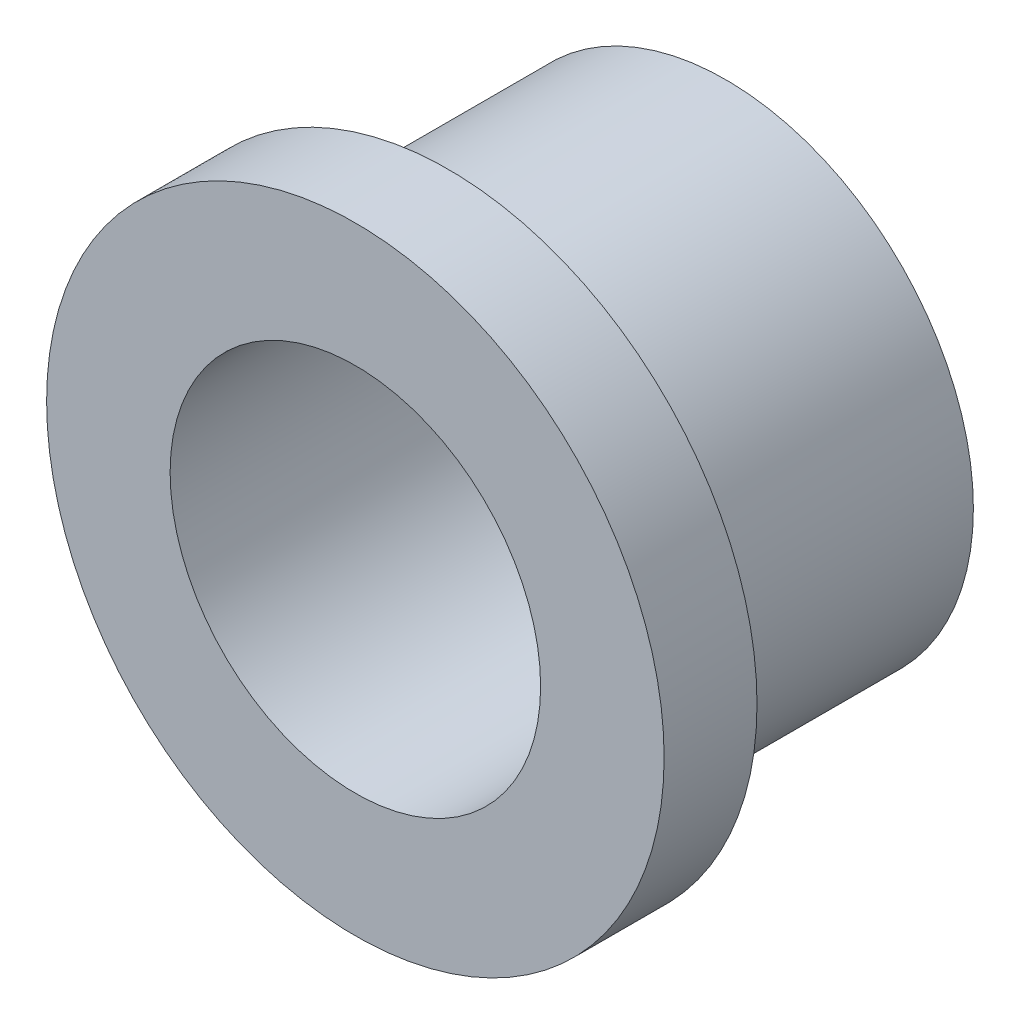
ISO-10303-21;
HEADER;
FILE_DESCRIPTION(('STEP AP214'),'2;1');
FILE_NAME('part.step','',(''),(''),'','','');
FILE_SCHEMA(('AUTOMOTIVE_DESIGN { 1 0 10303 214 1 1 1 1 }'));
ENDSEC;
DATA;
#1=APPLICATION_CONTEXT('core data for automotive mechanical design processes');
#2=APPLICATION_PROTOCOL_DEFINITION('international standard','automotive_design',2000,#1);
#3=PRODUCT_CONTEXT('',#1,'mechanical');
#4=PRODUCT('Part','Part','',(#3));
#5=PRODUCT_RELATED_PRODUCT_CATEGORY('part','',(#4));
#6=PRODUCT_DEFINITION_FORMATION('','',#4);
#7=PRODUCT_DEFINITION_CONTEXT('part definition',#1,'design');
#8=PRODUCT_DEFINITION('design','',#6,#7);
#9=PRODUCT_DEFINITION_SHAPE('','',#8);
#10=(LENGTH_UNIT() NAMED_UNIT(*) SI_UNIT(.MILLI.,.METRE.));
#11=(NAMED_UNIT(*) PLANE_ANGLE_UNIT() SI_UNIT($,.RADIAN.));
#12=(NAMED_UNIT(*) SI_UNIT($,.STERADIAN.) SOLID_ANGLE_UNIT());
#13=UNCERTAINTY_MEASURE_WITH_UNIT(LENGTH_MEASURE(1.E-05),#10,'distance_accuracy_value','');
#14=(GEOMETRIC_REPRESENTATION_CONTEXT(3) GLOBAL_UNCERTAINTY_ASSIGNED_CONTEXT((#13)) GLOBAL_UNIT_ASSIGNED_CONTEXT((#10,
#11,#12)) REPRESENTATION_CONTEXT('',''));
#15=CARTESIAN_POINT('',(0.,0.,0.));
#16=DIRECTION('',(0.,0.,1.));
#17=DIRECTION('',(1.,0.,0.));
#18=AXIS2_PLACEMENT_3D('',#15,#16,#17);
#19=CARTESIAN_POINT('',(0.,0.,0.));
#20=DIRECTION('',(0.,0.,1.));
#21=DIRECTION('',(1.,0.,0.));
#22=AXIS2_PLACEMENT_3D('',#19,#20,#21);
#23=CYLINDRICAL_SURFACE('',#22,4.7625);
#24=CARTESIAN_POINT('',(0.,0.,-9.525));
#25=DIRECTION('',(0.,0.,1.));
#26=DIRECTION('',(1.,0.,0.));
#27=AXIS2_PLACEMENT_3D('',#24,#25,#26);
#28=CIRCLE('',#27,4.7625);
#29=CARTESIAN_POINT('',(4.7625,0.,-9.525));
#30=VERTEX_POINT('',#29);
#31=EDGE_CURVE('E55',#30,#30,#28,.T.);
#32=ORIENTED_EDGE('',*,*,#31,.F.);
#33=EDGE_LOOP('',(#32));
#34=FACE_BOUND('',#33,.T.);
#35=CARTESIAN_POINT('',(0.,0.,0.));
#36=DIRECTION('',(0.,0.,1.));
#37=DIRECTION('',(1.,0.,0.));
#38=AXIS2_PLACEMENT_3D('',#35,#36,#37);
#39=CIRCLE('',#38,4.7625);
#40=CARTESIAN_POINT('',(4.7625,0.,0.));
#41=VERTEX_POINT('',#40);
#42=EDGE_CURVE('E10',#41,#41,#39,.T.);
#43=ORIENTED_EDGE('',*,*,#42,.T.);
#44=EDGE_LOOP('',(#43));
#45=FACE_BOUND('',#44,.T.);
#46=ADVANCED_FACE('F33',(#34,#45),#23,.F.);
#47=CARTESIAN_POINT('',(0.,4.7625,0.));
#48=DIRECTION('',(0.,0.,-1.));
#49=DIRECTION('',(-1.,0.,0.));
#50=AXIS2_PLACEMENT_3D('',#47,#48,#49);
#51=PLANE('',#50);
#52=ORIENTED_EDGE('',*,*,#42,.F.);
#53=EDGE_LOOP('',(#52));
#54=FACE_BOUND('',#53,.T.);
#55=CARTESIAN_POINT('',(0.,0.,0.));
#56=DIRECTION('',(0.,0.,1.));
#57=DIRECTION('',(1.,0.,0.));
#58=AXIS2_PLACEMENT_3D('',#55,#56,#57);
#59=CIRCLE('',#58,7.9375);
#60=CARTESIAN_POINT('',(7.9375,0.,0.));
#61=VERTEX_POINT('',#60);
#62=EDGE_CURVE('E39',#61,#61,#59,.T.);
#63=ORIENTED_EDGE('',*,*,#62,.T.);
#64=EDGE_LOOP('',(#63));
#65=FACE_BOUND('',#64,.T.);
#66=ADVANCED_FACE('F62',(#54,#65),#51,.F.);
#67=CARTESIAN_POINT('',(0.,0.,0.));
#68=DIRECTION('',(0.,0.,1.));
#69=DIRECTION('',(1.,0.,0.));
#70=AXIS2_PLACEMENT_3D('',#67,#68,#69);
#71=CYLINDRICAL_SURFACE('',#70,7.9375);
#72=ORIENTED_EDGE('',*,*,#62,.F.);
#73=EDGE_LOOP('',(#72));
#74=FACE_BOUND('',#73,.T.);
#75=CARTESIAN_POINT('',(0.,0.,-2.3876));
#76=DIRECTION('',(0.,0.,1.));
#77=DIRECTION('',(1.,0.,0.));
#78=AXIS2_PLACEMENT_3D('',#75,#76,#77);
#79=CIRCLE('',#78,7.9375);
#80=CARTESIAN_POINT('',(7.9375,0.,-2.3876));
#81=VERTEX_POINT('',#80);
#82=EDGE_CURVE('E43',#81,#81,#79,.T.);
#83=ORIENTED_EDGE('',*,*,#82,.T.);
#84=EDGE_LOOP('',(#83));
#85=FACE_BOUND('',#84,.T.);
#86=ADVANCED_FACE('F66',(#74,#85),#71,.T.);
#87=CARTESIAN_POINT('',(0.,7.9375,-2.3876));
#88=DIRECTION('',(0.,0.,1.));
#89=DIRECTION('',(1.,0.,0.));
#90=AXIS2_PLACEMENT_3D('',#87,#88,#89);
#91=PLANE('',#90);
#92=ORIENTED_EDGE('',*,*,#82,.F.);
#93=EDGE_LOOP('',(#92));
#94=FACE_BOUND('',#93,.T.);
#95=CARTESIAN_POINT('',(0.,0.,-2.3876));
#96=DIRECTION('',(0.,0.,1.));
#97=DIRECTION('',(1.,0.,0.));
#98=AXIS2_PLACEMENT_3D('',#95,#96,#97);
#99=CIRCLE('',#98,6.3627);
#100=CARTESIAN_POINT('',(6.3627,0.,-2.3876));
#101=VERTEX_POINT('',#100);
#102=EDGE_CURVE('E47',#101,#101,#99,.T.);
#103=ORIENTED_EDGE('',*,*,#102,.T.);
#104=EDGE_LOOP('',(#103));
#105=FACE_BOUND('',#104,.T.);
#106=ADVANCED_FACE('F71',(#94,#105),#91,.F.);
#107=CARTESIAN_POINT('',(0.,0.,0.));
#108=DIRECTION('',(0.,0.,1.));
#109=DIRECTION('',(1.,0.,0.));
#110=AXIS2_PLACEMENT_3D('',#107,#108,#109);
#111=CYLINDRICAL_SURFACE('',#110,6.3627);
#112=ORIENTED_EDGE('',*,*,#102,.F.);
#113=EDGE_LOOP('',(#112));
#114=FACE_BOUND('',#113,.T.);
#115=CARTESIAN_POINT('',(0.,0.,-9.525));
#116=DIRECTION('',(0.,0.,1.));
#117=DIRECTION('',(1.,0.,0.));
#118=AXIS2_PLACEMENT_3D('',#115,#116,#117);
#119=CIRCLE('',#118,6.3627);
#120=CARTESIAN_POINT('',(6.3627,0.,-9.525));
#121=VERTEX_POINT('',#120);
#122=EDGE_CURVE('E52',#121,#121,#119,.T.);
#123=ORIENTED_EDGE('',*,*,#122,.T.);
#124=EDGE_LOOP('',(#123));
#125=FACE_BOUND('',#124,.T.);
#126=ADVANCED_FACE('F77',(#114,#125),#111,.T.);
#127=CARTESIAN_POINT('',(0.,6.3627,-9.525));
#128=DIRECTION('',(0.,0.,1.));
#129=DIRECTION('',(1.,0.,0.));
#130=AXIS2_PLACEMENT_3D('',#127,#128,#129);
#131=PLANE('',#130);
#132=ORIENTED_EDGE('',*,*,#122,.F.);
#133=EDGE_LOOP('',(#132));
#134=FACE_BOUND('',#133,.T.);
#135=ORIENTED_EDGE('',*,*,#31,.T.);
#136=EDGE_LOOP('',(#135));
#137=FACE_BOUND('',#136,.T.);
#138=ADVANCED_FACE('F59',(#134,#137),#131,.F.);
#139=CLOSED_SHELL('',(#46,#66,#86,#106,#126,#138));
#140=MANIFOLD_SOLID_BREP('B2',#139);
#141=ADVANCED_BREP_SHAPE_REPRESENTATION('',(#18,#140),#14);
#142=SHAPE_DEFINITION_REPRESENTATION(#9,#141);
ENDSEC;
END-ISO-10303-21;
